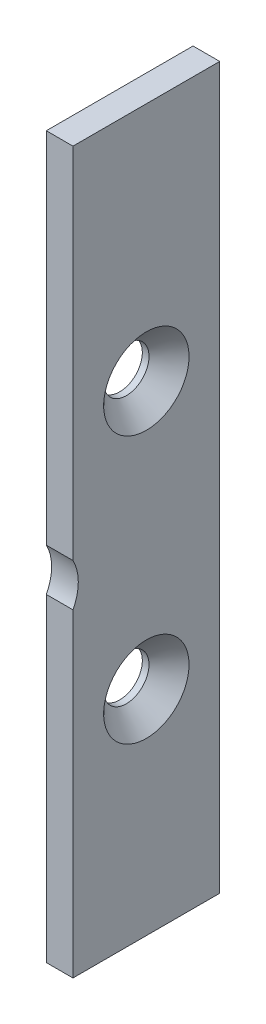
ISO-10303-21;
HEADER;
FILE_DESCRIPTION(('STEP AP214'),'2;1');
FILE_NAME('part.step','',(''),(''),'','','');
FILE_SCHEMA(('AUTOMOTIVE_DESIGN { 1 0 10303 214 1 1 1 1 }'));
ENDSEC;
DATA;
#1=APPLICATION_CONTEXT('core data for automotive mechanical design processes');
#2=APPLICATION_PROTOCOL_DEFINITION('international standard','automotive_design',2000,#1);
#3=PRODUCT_CONTEXT('',#1,'mechanical');
#4=PRODUCT('Part','Part','',(#3));
#5=PRODUCT_RELATED_PRODUCT_CATEGORY('part','',(#4));
#6=PRODUCT_DEFINITION_FORMATION('','',#4);
#7=PRODUCT_DEFINITION_CONTEXT('part definition',#1,'design');
#8=PRODUCT_DEFINITION('design','',#6,#7);
#9=PRODUCT_DEFINITION_SHAPE('','',#8);
#10=(LENGTH_UNIT() NAMED_UNIT(*) SI_UNIT(.MILLI.,.METRE.));
#11=(NAMED_UNIT(*) PLANE_ANGLE_UNIT() SI_UNIT($,.RADIAN.));
#12=(NAMED_UNIT(*) SI_UNIT($,.STERADIAN.) SOLID_ANGLE_UNIT());
#13=UNCERTAINTY_MEASURE_WITH_UNIT(LENGTH_MEASURE(1.E-05),#10,'distance_accuracy_value','');
#14=(GEOMETRIC_REPRESENTATION_CONTEXT(3) GLOBAL_UNCERTAINTY_ASSIGNED_CONTEXT((#13)) GLOBAL_UNIT_ASSIGNED_CONTEXT((#10,
#11,#12)) REPRESENTATION_CONTEXT('',''));
#15=CARTESIAN_POINT('',(0.,0.,0.));
#16=DIRECTION('',(0.,0.,1.));
#17=DIRECTION('',(1.,0.,0.));
#18=AXIS2_PLACEMENT_3D('',#15,#16,#17);
#19=CARTESIAN_POINT('',(0.,0.,-22.5));
#20=DIRECTION('',(0.,0.,1.));
#21=DIRECTION('',(1.,0.,0.));
#22=AXIS2_PLACEMENT_3D('',#19,#20,#21);
#23=PLANE('',#22);
#24=DIRECTION('',(0.,-1.,0.));
#25=VECTOR('',#24,1.);
#26=CARTESIAN_POINT('',(58.2,-0.5,-22.5));
#27=LINE('',#26,#25);
#28=CARTESIAN_POINT('',(58.2,-0.5,-22.5));
#29=VERTEX_POINT('',#28);
#30=CARTESIAN_POINT('',(58.2,-27.4,-22.5));
#31=VERTEX_POINT('',#30);
#32=EDGE_CURVE('E146',#29,#31,#27,.T.);
#33=ORIENTED_EDGE('',*,*,#32,.T.);
#34=DIRECTION('',(-1.,0.,0.));
#35=VECTOR('',#34,1.);
#36=CARTESIAN_POINT('',(60.3,-27.4,-22.5));
#37=LINE('',#36,#35);
#38=CARTESIAN_POINT('',(60.2,-27.4,-22.5));
#39=VERTEX_POINT('',#38);
#40=EDGE_CURVE('E11',#31,#39,#37,.F.);
#41=ORIENTED_EDGE('',*,*,#40,.T.);
#42=DIRECTION('',(0.,1.,0.));
#43=VECTOR('',#42,1.);
#44=CARTESIAN_POINT('',(60.2,-54.5,-22.5));
#45=LINE('',#44,#43);
#46=CARTESIAN_POINT('',(60.2,-0.5,-22.5));
#47=VERTEX_POINT('',#46);
#48=EDGE_CURVE('E113',#39,#47,#45,.T.);
#49=ORIENTED_EDGE('',*,*,#48,.T.);
#50=DIRECTION('',(-1.,0.,0.));
#51=VECTOR('',#50,1.);
#52=CARTESIAN_POINT('',(60.2,-0.5,-22.5));
#53=LINE('',#52,#51);
#54=EDGE_CURVE('E63',#47,#29,#53,.T.);
#55=ORIENTED_EDGE('',*,*,#54,.T.);
#56=EDGE_LOOP('',(#33,#41,#49,#55));
#57=FACE_BOUND('',#56,.T.);
#58=ADVANCED_FACE('F41',(#57),#23,.T.);
#59=CARTESIAN_POINT('',(60.2,-54.5,-22.5));
#60=VERTEX_POINT('',#59);
#61=CARTESIAN_POINT('',(60.2,-30.6,-22.5));
#62=VERTEX_POINT('',#61);
#63=EDGE_CURVE('E111',#60,#62,#45,.T.);
#64=ORIENTED_EDGE('',*,*,#63,.T.);
#65=DIRECTION('',(-1.,0.,0.));
#66=VECTOR('',#65,1.);
#67=CARTESIAN_POINT('',(60.3,-30.6,-22.5));
#68=LINE('',#67,#66);
#69=CARTESIAN_POINT('',(58.2,-30.6,-22.5));
#70=VERTEX_POINT('',#69);
#71=EDGE_CURVE('E47',#62,#70,#68,.T.);
#72=ORIENTED_EDGE('',*,*,#71,.T.);
#73=CARTESIAN_POINT('',(58.2,-54.5,-22.5));
#74=VERTEX_POINT('',#73);
#75=EDGE_CURVE('E95',#70,#74,#27,.T.);
#76=ORIENTED_EDGE('',*,*,#75,.T.);
#77=DIRECTION('',(1.,0.,0.));
#78=VECTOR('',#77,1.);
#79=CARTESIAN_POINT('',(58.2,-54.5,-22.5));
#80=LINE('',#79,#78);
#81=EDGE_CURVE('E120',#74,#60,#80,.T.);
#82=ORIENTED_EDGE('',*,*,#81,.T.);
#83=EDGE_LOOP('',(#64,#72,#76,#82));
#84=FACE_BOUND('',#83,.T.);
#85=ADVANCED_FACE('F116',(#84),#23,.T.);
#86=CARTESIAN_POINT('',(58.2,-0.5,-22.5));
#87=DIRECTION('',(1.,0.,0.));
#88=DIRECTION('',(0.,0.,-1.));
#89=AXIS2_PLACEMENT_3D('',#86,#87,#88);
#90=PLANE('',#89);
#91=CARTESIAN_POINT('',(58.2,-38.5,-28.));
#92=DIRECTION('',(1.,0.,0.));
#93=DIRECTION('',(0.,0.,-1.));
#94=AXIS2_PLACEMENT_3D('',#91,#92,#93);
#95=CIRCLE('',#94,1.7);
#96=CARTESIAN_POINT('',(58.2,-38.5,-29.7));
#97=VERTEX_POINT('',#96);
#98=EDGE_CURVE('E157',#97,#97,#95,.F.);
#99=ORIENTED_EDGE('',*,*,#98,.F.);
#100=EDGE_LOOP('',(#99));
#101=FACE_BOUND('',#100,.T.);
#102=CARTESIAN_POINT('',(58.2,-18.5,-28.));
#103=DIRECTION('',(1.,0.,0.));
#104=DIRECTION('',(0.,0.,-1.));
#105=AXIS2_PLACEMENT_3D('',#102,#103,#104);
#106=CIRCLE('',#105,1.7);
#107=CARTESIAN_POINT('',(58.2,-18.5,-29.7));
#108=VERTEX_POINT('',#107);
#109=EDGE_CURVE('E112',#108,#108,#106,.F.);
#110=ORIENTED_EDGE('',*,*,#109,.F.);
#111=EDGE_LOOP('',(#110));
#112=FACE_BOUND('',#111,.T.);
#113=CARTESIAN_POINT('',(58.2,-29.,-19.5));
#114=DIRECTION('',(1.,0.,0.));
#115=DIRECTION('',(0.,0.,-1.));
#116=AXIS2_PLACEMENT_3D('',#113,#114,#115);
#117=CIRCLE('',#116,3.4);
#118=EDGE_CURVE('E57',#31,#70,#117,.F.);
#119=ORIENTED_EDGE('',*,*,#118,.F.);
#120=ORIENTED_EDGE('',*,*,#32,.F.);
#121=DIRECTION('',(0.,0.,-1.));
#122=VECTOR('',#121,1.);
#123=CARTESIAN_POINT('',(58.2,-0.5,-22.5));
#124=LINE('',#123,#122);
#125=CARTESIAN_POINT('',(58.2,-0.5,-33.5));
#126=VERTEX_POINT('',#125);
#127=EDGE_CURVE('E119',#29,#126,#124,.T.);
#128=ORIENTED_EDGE('',*,*,#127,.T.);
#129=DIRECTION('',(0.,-1.,0.));
#130=VECTOR('',#129,1.);
#131=CARTESIAN_POINT('',(58.2,-0.5,-33.5));
#132=LINE('',#131,#130);
#133=CARTESIAN_POINT('',(58.2,-54.5,-33.5));
#134=VERTEX_POINT('',#133);
#135=EDGE_CURVE('E123',#126,#134,#132,.T.);
#136=ORIENTED_EDGE('',*,*,#135,.T.);
#137=DIRECTION('',(0.,0.,-1.));
#138=VECTOR('',#137,1.);
#139=CARTESIAN_POINT('',(58.2,-54.5,-22.5));
#140=LINE('',#139,#138);
#141=EDGE_CURVE('E102',#74,#134,#140,.T.);
#142=ORIENTED_EDGE('',*,*,#141,.F.);
#143=ORIENTED_EDGE('',*,*,#75,.F.);
#144=EDGE_LOOP('',(#119,#120,#128,#136,#142,#143));
#145=FACE_BOUND('',#144,.T.);
#146=ADVANCED_FACE('F43',(#101,#112,#145),#90,.F.);
#147=CARTESIAN_POINT('',(58.2,-54.5,-22.5));
#148=DIRECTION('',(0.,1.,0.));
#149=DIRECTION('',(0.,0.,1.));
#150=AXIS2_PLACEMENT_3D('',#147,#148,#149);
#151=PLANE('',#150);
#152=DIRECTION('',(1.,0.,0.));
#153=VECTOR('',#152,1.);
#154=CARTESIAN_POINT('',(58.2,-54.5,-33.5));
#155=LINE('',#154,#153);
#156=CARTESIAN_POINT('',(60.2,-54.5,-33.5));
#157=VERTEX_POINT('',#156);
#158=EDGE_CURVE('E129',#134,#157,#155,.T.);
#159=ORIENTED_EDGE('',*,*,#158,.T.);
#160=DIRECTION('',(0.,0.,-1.));
#161=VECTOR('',#160,1.);
#162=CARTESIAN_POINT('',(60.2,-54.5,-22.5));
#163=LINE('',#162,#161);
#164=EDGE_CURVE('E139',#60,#157,#163,.T.);
#165=ORIENTED_EDGE('',*,*,#164,.F.);
#166=ORIENTED_EDGE('',*,*,#81,.F.);
#167=ORIENTED_EDGE('',*,*,#141,.T.);
#168=EDGE_LOOP('',(#159,#165,#166,#167));
#169=FACE_BOUND('',#168,.T.);
#170=ADVANCED_FACE('F142',(#169),#151,.F.);
#171=CARTESIAN_POINT('',(60.2,-54.5,-22.5));
#172=DIRECTION('',(-1.,0.,0.));
#173=DIRECTION('',(0.,0.,1.));
#174=AXIS2_PLACEMENT_3D('',#171,#172,#173);
#175=PLANE('',#174);
#176=CARTESIAN_POINT('',(60.2,-38.5,-28.));
#177=DIRECTION('',(1.,0.,0.));
#178=DIRECTION('',(0.,0.,-1.));
#179=AXIS2_PLACEMENT_3D('',#176,#177,#178);
#180=CIRCLE('',#179,3.2);
#181=CARTESIAN_POINT('',(60.2,-38.5,-31.2));
#182=VERTEX_POINT('',#181);
#183=EDGE_CURVE('E161',#182,#182,#180,.T.);
#184=ORIENTED_EDGE('',*,*,#183,.F.);
#185=EDGE_LOOP('',(#184));
#186=FACE_BOUND('',#185,.T.);
#187=CARTESIAN_POINT('',(60.2,-18.5,-28.));
#188=DIRECTION('',(1.,0.,0.));
#189=DIRECTION('',(0.,0.,-1.));
#190=AXIS2_PLACEMENT_3D('',#187,#188,#189);
#191=CIRCLE('',#190,3.2);
#192=CARTESIAN_POINT('',(60.2,-18.5,-31.2));
#193=VERTEX_POINT('',#192);
#194=EDGE_CURVE('E153',#193,#193,#191,.T.);
#195=ORIENTED_EDGE('',*,*,#194,.F.);
#196=EDGE_LOOP('',(#195));
#197=FACE_BOUND('',#196,.T.);
#198=CARTESIAN_POINT('',(60.2,-29.,-19.5));
#199=DIRECTION('',(-1.,0.,0.));
#200=DIRECTION('',(0.,0.,1.));
#201=AXIS2_PLACEMENT_3D('',#198,#199,#200);
#202=CIRCLE('',#201,3.4);
#203=EDGE_CURVE('E101',#62,#39,#202,.F.);
#204=ORIENTED_EDGE('',*,*,#203,.F.);
#205=ORIENTED_EDGE('',*,*,#63,.F.);
#206=ORIENTED_EDGE('',*,*,#164,.T.);
#207=DIRECTION('',(0.,1.,0.));
#208=VECTOR('',#207,1.);
#209=CARTESIAN_POINT('',(60.2,-54.5,-33.5));
#210=LINE('',#209,#208);
#211=CARTESIAN_POINT('',(60.2,-0.5,-33.5));
#212=VERTEX_POINT('',#211);
#213=EDGE_CURVE('E128',#157,#212,#210,.T.);
#214=ORIENTED_EDGE('',*,*,#213,.T.);
#215=DIRECTION('',(0.,0.,-1.));
#216=VECTOR('',#215,1.);
#217=CARTESIAN_POINT('',(60.2,-0.5,-22.5));
#218=LINE('',#217,#216);
#219=EDGE_CURVE('E133',#47,#212,#218,.T.);
#220=ORIENTED_EDGE('',*,*,#219,.F.);
#221=ORIENTED_EDGE('',*,*,#48,.F.);
#222=EDGE_LOOP('',(#204,#205,#206,#214,#220,#221));
#223=FACE_BOUND('',#222,.T.);
#224=ADVANCED_FACE('F107',(#186,#197,#223),#175,.F.);
#225=CARTESIAN_POINT('',(60.2,-0.5,-22.5));
#226=DIRECTION('',(0.,-1.,0.));
#227=DIRECTION('',(0.,0.,-1.));
#228=AXIS2_PLACEMENT_3D('',#225,#226,#227);
#229=PLANE('',#228);
#230=DIRECTION('',(-1.,0.,0.));
#231=VECTOR('',#230,1.);
#232=CARTESIAN_POINT('',(60.2,-0.5,-33.5));
#233=LINE('',#232,#231);
#234=EDGE_CURVE('E89',#212,#126,#233,.T.);
#235=ORIENTED_EDGE('',*,*,#234,.T.);
#236=ORIENTED_EDGE('',*,*,#127,.F.);
#237=ORIENTED_EDGE('',*,*,#54,.F.);
#238=ORIENTED_EDGE('',*,*,#219,.T.);
#239=EDGE_LOOP('',(#235,#236,#237,#238));
#240=FACE_BOUND('',#239,.T.);
#241=ADVANCED_FACE('F149',(#240),#229,.F.);
#242=CARTESIAN_POINT('',(0.,0.,-33.5));
#243=DIRECTION('',(0.,0.,1.));
#244=DIRECTION('',(1.,0.,0.));
#245=AXIS2_PLACEMENT_3D('',#242,#243,#244);
#246=PLANE('',#245);
#247=ORIENTED_EDGE('',*,*,#135,.F.);
#248=ORIENTED_EDGE('',*,*,#234,.F.);
#249=ORIENTED_EDGE('',*,*,#213,.F.);
#250=ORIENTED_EDGE('',*,*,#158,.F.);
#251=EDGE_LOOP('',(#247,#248,#249,#250));
#252=FACE_BOUND('',#251,.T.);
#253=ADVANCED_FACE('F147',(#252),#246,.F.);
#254=CARTESIAN_POINT('',(60.3,-29.,-19.5));
#255=DIRECTION('',(-1.,0.,0.));
#256=DIRECTION('',(0.,0.,1.));
#257=AXIS2_PLACEMENT_3D('',#254,#255,#256);
#258=CYLINDRICAL_SURFACE('',#257,3.4);
#259=ORIENTED_EDGE('',*,*,#118,.T.);
#260=ORIENTED_EDGE('',*,*,#71,.F.);
#261=ORIENTED_EDGE('',*,*,#203,.T.);
#262=ORIENTED_EDGE('',*,*,#40,.F.);
#263=EDGE_LOOP('',(#259,#260,#261,#262));
#264=FACE_BOUND('',#263,.T.);
#265=ADVANCED_FACE('F105',(#264),#258,.F.);
#266=CARTESIAN_POINT('',(58.,-18.5,-28.));
#267=DIRECTION('',(1.,0.,0.));
#268=DIRECTION('',(0.,0.,-1.));
#269=AXIS2_PLACEMENT_3D('',#266,#267,#268);
#270=CYLINDRICAL_SURFACE('',#269,1.7);
#271=CARTESIAN_POINT('',(58.7,-18.5,-28.));
#272=DIRECTION('',(1.,0.,0.));
#273=DIRECTION('',(0.,0.,-1.));
#274=AXIS2_PLACEMENT_3D('',#271,#272,#273);
#275=CIRCLE('',#274,1.7);
#276=CARTESIAN_POINT('',(58.7,-18.5,-29.7));
#277=VERTEX_POINT('',#276);
#278=EDGE_CURVE('E156',#277,#277,#275,.T.);
#279=ORIENTED_EDGE('',*,*,#278,.T.);
#280=EDGE_LOOP('',(#279));
#281=FACE_BOUND('',#280,.T.);
#282=ORIENTED_EDGE('',*,*,#109,.T.);
#283=EDGE_LOOP('',(#282));
#284=FACE_BOUND('',#283,.T.);
#285=ADVANCED_FACE('F187',(#281,#284),#270,.F.);
#286=CARTESIAN_POINT('',(60.2,-18.5,-28.));
#287=DIRECTION('',(1.,0.,0.));
#288=DIRECTION('',(0.,0.,-1.));
#289=AXIS2_PLACEMENT_3D('',#286,#287,#288);
#290=CONICAL_SURFACE('',#289,3.2,0.785398163397448);
#291=ORIENTED_EDGE('',*,*,#278,.F.);
#292=EDGE_LOOP('',(#291));
#293=FACE_BOUND('',#292,.T.);
#294=ORIENTED_EDGE('',*,*,#194,.T.);
#295=EDGE_LOOP('',(#294));
#296=FACE_BOUND('',#295,.T.);
#297=ADVANCED_FACE('F183',(#293,#296),#290,.F.);
#298=CARTESIAN_POINT('',(58.,-38.5,-28.));
#299=DIRECTION('',(1.,0.,0.));
#300=DIRECTION('',(0.,0.,-1.));
#301=AXIS2_PLACEMENT_3D('',#298,#299,#300);
#302=CYLINDRICAL_SURFACE('',#301,1.7);
#303=CARTESIAN_POINT('',(58.7,-38.5,-28.));
#304=DIRECTION('',(1.,0.,0.));
#305=DIRECTION('',(0.,0.,-1.));
#306=AXIS2_PLACEMENT_3D('',#303,#304,#305);
#307=CIRCLE('',#306,1.7);
#308=CARTESIAN_POINT('',(58.7,-38.5,-29.7));
#309=VERTEX_POINT('',#308);
#310=EDGE_CURVE('E168',#309,#309,#307,.T.);
#311=ORIENTED_EDGE('',*,*,#310,.T.);
#312=EDGE_LOOP('',(#311));
#313=FACE_BOUND('',#312,.T.);
#314=ORIENTED_EDGE('',*,*,#98,.T.);
#315=EDGE_LOOP('',(#314));
#316=FACE_BOUND('',#315,.T.);
#317=ADVANCED_FACE('F167',(#313,#316),#302,.F.);
#318=CARTESIAN_POINT('',(60.2,-38.5,-28.));
#319=DIRECTION('',(1.,0.,0.));
#320=DIRECTION('',(0.,0.,-1.));
#321=AXIS2_PLACEMENT_3D('',#318,#319,#320);
#322=CONICAL_SURFACE('',#321,3.2,0.785398163397448);
#323=ORIENTED_EDGE('',*,*,#310,.F.);
#324=EDGE_LOOP('',(#323));
#325=FACE_BOUND('',#324,.T.);
#326=ORIENTED_EDGE('',*,*,#183,.T.);
#327=EDGE_LOOP('',(#326));
#328=FACE_BOUND('',#327,.T.);
#329=ADVANCED_FACE('F173',(#325,#328),#322,.F.);
#330=CLOSED_SHELL('',(#58,#85,#146,#170,#224,#241,#253,#265,#285,#297,#317,#329));
#331=MANIFOLD_SOLID_BREP('B2',#330);
#332=ADVANCED_BREP_SHAPE_REPRESENTATION('',(#18,#331),#14);
#333=SHAPE_DEFINITION_REPRESENTATION(#9,#332);
ENDSEC;
END-ISO-10303-21;
